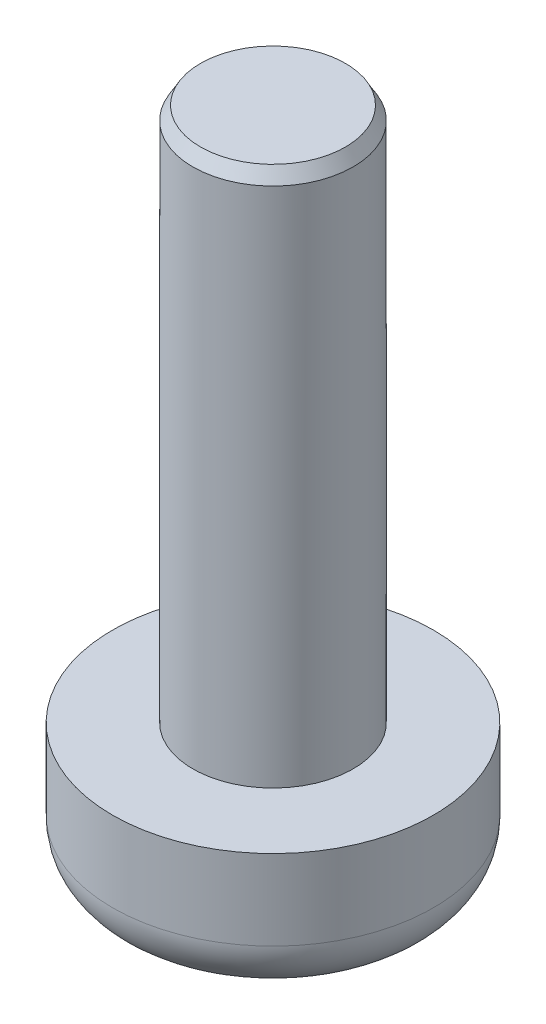
ISO-10303-21;
HEADER;
FILE_DESCRIPTION(('STEP AP214'),'2;1');
FILE_NAME('part.step','',(''),(''),'','','');
FILE_SCHEMA(('AUTOMOTIVE_DESIGN { 1 0 10303 214 1 1 1 1 }'));
ENDSEC;
DATA;
#1=APPLICATION_CONTEXT('core data for automotive mechanical design processes');
#2=APPLICATION_PROTOCOL_DEFINITION('international standard','automotive_design',2000,#1);
#3=PRODUCT_CONTEXT('',#1,'mechanical');
#4=PRODUCT('Part','Part','',(#3));
#5=PRODUCT_RELATED_PRODUCT_CATEGORY('part','',(#4));
#6=PRODUCT_DEFINITION_FORMATION('','',#4);
#7=PRODUCT_DEFINITION_CONTEXT('part definition',#1,'design');
#8=PRODUCT_DEFINITION('design','',#6,#7);
#9=PRODUCT_DEFINITION_SHAPE('','',#8);
#10=(LENGTH_UNIT() NAMED_UNIT(*) SI_UNIT(.MILLI.,.METRE.));
#11=(NAMED_UNIT(*) PLANE_ANGLE_UNIT() SI_UNIT($,.RADIAN.));
#12=(NAMED_UNIT(*) SI_UNIT($,.STERADIAN.) SOLID_ANGLE_UNIT());
#13=UNCERTAINTY_MEASURE_WITH_UNIT(LENGTH_MEASURE(1.E-05),#10,'distance_accuracy_value','');
#14=(GEOMETRIC_REPRESENTATION_CONTEXT(3) GLOBAL_UNCERTAINTY_ASSIGNED_CONTEXT((#13)) GLOBAL_UNIT_ASSIGNED_CONTEXT((#10,
#11,#12)) REPRESENTATION_CONTEXT('',''));
#15=CARTESIAN_POINT('',(0.,0.,0.));
#16=DIRECTION('',(0.,0.,1.));
#17=DIRECTION('',(1.,0.,0.));
#18=AXIS2_PLACEMENT_3D('',#15,#16,#17);
#19=CARTESIAN_POINT('',(0.,10.,0.));
#20=DIRECTION('',(0.,-1.,0.));
#21=DIRECTION('',(0.,0.,-1.));
#22=AXIS2_PLACEMENT_3D('',#19,#20,#21);
#23=CYLINDRICAL_SURFACE('',#22,1.5);
#24=CARTESIAN_POINT('',(0.,9.75,0.));
#25=DIRECTION('',(0.,1.,0.));
#26=DIRECTION('',(0.,0.,1.));
#27=AXIS2_PLACEMENT_3D('',#24,#25,#26);
#28=CIRCLE('',#27,1.5);
#29=CARTESIAN_POINT('',(0.,9.75,1.5));
#30=VERTEX_POINT('',#29);
#31=EDGE_CURVE('E153',#30,#30,#28,.F.);
#32=ORIENTED_EDGE('',*,*,#31,.T.);
#33=EDGE_LOOP('',(#32));
#34=FACE_BOUND('',#33,.T.);
#35=CARTESIAN_POINT('',(0.,0.,0.));
#36=DIRECTION('',(0.,-1.,0.));
#37=DIRECTION('',(0.,0.,-1.));
#38=AXIS2_PLACEMENT_3D('',#35,#36,#37);
#39=CIRCLE('',#38,1.5);
#40=CARTESIAN_POINT('',(0.,0.,-1.5));
#41=VERTEX_POINT('',#40);
#42=EDGE_CURVE('E147',#41,#41,#39,.T.);
#43=ORIENTED_EDGE('',*,*,#42,.F.);
#44=EDGE_LOOP('',(#43));
#45=FACE_BOUND('',#44,.T.);
#46=ADVANCED_FACE('F37',(#34,#45),#23,.T.);
#47=CARTESIAN_POINT('',(0.,10.,0.));
#48=DIRECTION('',(0.,1.,0.));
#49=DIRECTION('',(0.,0.,1.));
#50=AXIS2_PLACEMENT_3D('',#47,#48,#49);
#51=PLANE('',#50);
#52=CARTESIAN_POINT('',(0.,10.,0.));
#53=DIRECTION('',(0.,1.,0.));
#54=DIRECTION('',(0.,0.,1.));
#55=AXIS2_PLACEMENT_3D('',#52,#53,#54);
#56=CIRCLE('',#55,1.35566243270259);
#57=CARTESIAN_POINT('',(0.,10.,1.35566243270259));
#58=VERTEX_POINT('',#57);
#59=EDGE_CURVE('E150',#58,#58,#56,.T.);
#60=ORIENTED_EDGE('',*,*,#59,.T.);
#61=EDGE_LOOP('',(#60));
#62=FACE_BOUND('',#61,.T.);
#63=ADVANCED_FACE('F174',(#62),#51,.T.);
#64=CARTESIAN_POINT('',(0.,10.,0.));
#65=DIRECTION('',(0.,-1.,0.));
#66=DIRECTION('',(0.,0.,-1.));
#67=AXIS2_PLACEMENT_3D('',#64,#65,#66);
#68=CONICAL_SURFACE('',#67,1.35566243270259,0.523598775598299);
#69=ORIENTED_EDGE('',*,*,#31,.F.);
#70=EDGE_LOOP('',(#69));
#71=FACE_BOUND('',#70,.T.);
#72=ORIENTED_EDGE('',*,*,#59,.F.);
#73=EDGE_LOOP('',(#72));
#74=FACE_BOUND('',#73,.T.);
#75=ADVANCED_FACE('F180',(#71,#74),#68,.T.);
#76=CARTESIAN_POINT('',(0.,0.,0.));
#77=DIRECTION('',(0.,-1.,0.));
#78=DIRECTION('',(0.,0.,-1.));
#79=AXIS2_PLACEMENT_3D('',#76,#77,#78);
#80=PLANE('',#79);
#81=CARTESIAN_POINT('',(0.,0.,0.));
#82=DIRECTION('',(0.,-1.,0.));
#83=DIRECTION('',(0.,0.,-1.));
#84=AXIS2_PLACEMENT_3D('',#81,#82,#83);
#85=CIRCLE('',#84,3.);
#86=CARTESIAN_POINT('',(0.,0.,-3.));
#87=VERTEX_POINT('',#86);
#88=EDGE_CURVE('E139',#87,#87,#85,.T.);
#89=ORIENTED_EDGE('',*,*,#88,.F.);
#90=EDGE_LOOP('',(#89));
#91=FACE_BOUND('',#90,.T.);
#92=ORIENTED_EDGE('',*,*,#42,.T.);
#93=EDGE_LOOP('',(#92));
#94=FACE_BOUND('',#93,.T.);
#95=ADVANCED_FACE('F186',(#91,#94),#80,.F.);
#96=CARTESIAN_POINT('',(0.,-2.5,0.));
#97=DIRECTION('',(0.,1.,0.));
#98=DIRECTION('',(0.,0.,1.));
#99=AXIS2_PLACEMENT_3D('',#96,#97,#98);
#100=CYLINDRICAL_SURFACE('',#99,3.);
#101=CARTESIAN_POINT('',(0.,-1.5,0.));
#102=DIRECTION('',(0.,-1.,0.));
#103=DIRECTION('',(0.,0.,-1.));
#104=AXIS2_PLACEMENT_3D('',#101,#102,#103);
#105=CIRCLE('',#104,3.);
#106=CARTESIAN_POINT('',(0.,-1.5,-3.));
#107=VERTEX_POINT('',#106);
#108=EDGE_CURVE('E11',#107,#107,#105,.F.);
#109=ORIENTED_EDGE('',*,*,#108,.T.);
#110=EDGE_LOOP('',(#109));
#111=FACE_BOUND('',#110,.T.);
#112=ORIENTED_EDGE('',*,*,#88,.T.);
#113=EDGE_LOOP('',(#112));
#114=FACE_BOUND('',#113,.T.);
#115=ADVANCED_FACE('F169',(#111,#114),#100,.T.);
#116=CARTESIAN_POINT('',(0.,-2.5,0.));
#117=DIRECTION('',(0.,-1.,0.));
#118=DIRECTION('',(0.,0.,-1.));
#119=AXIS2_PLACEMENT_3D('',#116,#117,#118);
#120=PLANE('',#119);
#121=DIRECTION('',(-0.5,0.,-0.866025403784439));
#122=VECTOR('',#121,1.);
#123=CARTESIAN_POINT('',(-0.793856620135736,-2.5,1.375));
#124=LINE('',#123,#122);
#125=CARTESIAN_POINT('',(-0.793856620135736,-2.5,1.375));
#126=VERTEX_POINT('',#125);
#127=CARTESIAN_POINT('',(-1.58771324027147,-2.5,0.));
#128=VERTEX_POINT('',#127);
#129=EDGE_CURVE('E52',#126,#128,#124,.T.);
#130=ORIENTED_EDGE('',*,*,#129,.F.);
#131=DIRECTION('',(-1.,0.,0.));
#132=VECTOR('',#131,1.);
#133=CARTESIAN_POINT('',(0.793856620135736,-2.5,1.375));
#134=LINE('',#133,#132);
#135=CARTESIAN_POINT('',(0.793856620135736,-2.5,1.375));
#136=VERTEX_POINT('',#135);
#137=EDGE_CURVE('E135',#136,#126,#134,.T.);
#138=ORIENTED_EDGE('',*,*,#137,.F.);
#139=DIRECTION('',(-0.5,0.,0.866025403784438));
#140=VECTOR('',#139,1.);
#141=CARTESIAN_POINT('',(1.58771324027147,-2.5,0.));
#142=LINE('',#141,#140);
#143=CARTESIAN_POINT('',(1.58771324027147,-2.5,0.));
#144=VERTEX_POINT('',#143);
#145=EDGE_CURVE('E133',#144,#136,#142,.T.);
#146=ORIENTED_EDGE('',*,*,#145,.F.);
#147=DIRECTION('',(0.5,0.,0.866025403784439));
#148=VECTOR('',#147,1.);
#149=CARTESIAN_POINT('',(0.793856620135736,-2.5,-1.375));
#150=LINE('',#149,#148);
#151=CARTESIAN_POINT('',(0.793856620135736,-2.5,-1.375));
#152=VERTEX_POINT('',#151);
#153=EDGE_CURVE('E100',#152,#144,#150,.T.);
#154=ORIENTED_EDGE('',*,*,#153,.F.);
#155=DIRECTION('',(1.,0.,0.));
#156=VECTOR('',#155,1.);
#157=CARTESIAN_POINT('',(-0.793856620135736,-2.5,-1.375));
#158=LINE('',#157,#156);
#159=CARTESIAN_POINT('',(-0.793856620135736,-2.5,-1.375));
#160=VERTEX_POINT('',#159);
#161=EDGE_CURVE('E129',#160,#152,#158,.T.);
#162=ORIENTED_EDGE('',*,*,#161,.F.);
#163=DIRECTION('',(0.5,0.,-0.866025403784438));
#164=VECTOR('',#163,1.);
#165=CARTESIAN_POINT('',(-1.58771324027147,-2.5,0.));
#166=LINE('',#165,#164);
#167=EDGE_CURVE('E126',#128,#160,#166,.T.);
#168=ORIENTED_EDGE('',*,*,#167,.F.);
#169=EDGE_LOOP('',(#130,#138,#146,#154,#162,#168));
#170=FACE_BOUND('',#169,.T.);
#171=CARTESIAN_POINT('',(0.,-2.5,0.));
#172=DIRECTION('',(0.,-1.,0.));
#173=DIRECTION('',(0.,0.,-1.));
#174=AXIS2_PLACEMENT_3D('',#171,#172,#173);
#175=CIRCLE('',#174,2.);
#176=CARTESIAN_POINT('',(0.,-2.5,-2.));
#177=VERTEX_POINT('',#176);
#178=EDGE_CURVE('E45',#177,#177,#175,.T.);
#179=ORIENTED_EDGE('',*,*,#178,.T.);
#180=EDGE_LOOP('',(#179));
#181=FACE_BOUND('',#180,.T.);
#182=ADVANCED_FACE('F158',(#170,#181),#120,.T.);
#183=CARTESIAN_POINT('',(0.,-1.5,0.));
#184=DIRECTION('',(0.,-1.,0.));
#185=DIRECTION('',(0.,0.,-1.));
#186=AXIS2_PLACEMENT_3D('',#183,#184,#185);
#187=TOROIDAL_SURFACE('',#186,2.,1.);
#188=ORIENTED_EDGE('',*,*,#108,.F.);
#189=EDGE_LOOP('',(#188));
#190=FACE_BOUND('',#189,.T.);
#191=ORIENTED_EDGE('',*,*,#178,.F.);
#192=EDGE_LOOP('',(#191));
#193=FACE_BOUND('',#192,.T.);
#194=ADVANCED_FACE('F39',(#190,#193),#187,.T.);
#195=CARTESIAN_POINT('',(-0.793856620135736,-0.5,1.375));
#196=DIRECTION('',(-0.866025403784439,0.,0.5));
#197=DIRECTION('',(0.5,0.,0.866025403784439));
#198=AXIS2_PLACEMENT_3D('',#195,#196,#197);
#199=PLANE('',#198);
#200=ORIENTED_EDGE('',*,*,#129,.T.);
#201=DIRECTION('',(0.,-1.,0.));
#202=VECTOR('',#201,1.);
#203=CARTESIAN_POINT('',(-1.58771324027147,-0.5,0.));
#204=LINE('',#203,#202);
#205=CARTESIAN_POINT('',(-1.58771324027147,-0.5,0.));
#206=VERTEX_POINT('',#205);
#207=EDGE_CURVE('E82',#206,#128,#204,.T.);
#208=ORIENTED_EDGE('',*,*,#207,.F.);
#209=DIRECTION('',(-0.5,0.,-0.866025403784439));
#210=VECTOR('',#209,1.);
#211=CARTESIAN_POINT('',(-0.793856620135736,-0.5,1.375));
#212=LINE('',#211,#210);
#213=CARTESIAN_POINT('',(-0.793856620135736,-0.5,1.375));
#214=VERTEX_POINT('',#213);
#215=EDGE_CURVE('E137',#214,#206,#212,.T.);
#216=ORIENTED_EDGE('',*,*,#215,.F.);
#217=DIRECTION('',(0.,-1.,0.));
#218=VECTOR('',#217,1.);
#219=CARTESIAN_POINT('',(-0.793856620135736,-0.5,1.375));
#220=LINE('',#219,#218);
#221=EDGE_CURVE('E60',#214,#126,#220,.T.);
#222=ORIENTED_EDGE('',*,*,#221,.T.);
#223=EDGE_LOOP('',(#200,#208,#216,#222));
#224=FACE_BOUND('',#223,.T.);
#225=ADVANCED_FACE('F161',(#224),#199,.F.);
#226=CARTESIAN_POINT('',(0.793856620135736,-0.5,1.375));
#227=DIRECTION('',(0.,0.,1.));
#228=DIRECTION('',(1.,0.,0.));
#229=AXIS2_PLACEMENT_3D('',#226,#227,#228);
#230=PLANE('',#229);
#231=ORIENTED_EDGE('',*,*,#137,.T.);
#232=ORIENTED_EDGE('',*,*,#221,.F.);
#233=DIRECTION('',(-1.,0.,0.));
#234=VECTOR('',#233,1.);
#235=CARTESIAN_POINT('',(0.793856620135736,-0.5,1.375));
#236=LINE('',#235,#234);
#237=CARTESIAN_POINT('',(0.793856620135736,-0.5,1.375));
#238=VERTEX_POINT('',#237);
#239=EDGE_CURVE('E112',#238,#214,#236,.T.);
#240=ORIENTED_EDGE('',*,*,#239,.F.);
#241=DIRECTION('',(0.,-1.,0.));
#242=VECTOR('',#241,1.);
#243=CARTESIAN_POINT('',(0.793856620135736,-0.5,1.375));
#244=LINE('',#243,#242);
#245=EDGE_CURVE('E104',#238,#136,#244,.T.);
#246=ORIENTED_EDGE('',*,*,#245,.T.);
#247=EDGE_LOOP('',(#231,#232,#240,#246));
#248=FACE_BOUND('',#247,.T.);
#249=ADVANCED_FACE('F167',(#248),#230,.F.);
#250=CARTESIAN_POINT('',(1.58771324027147,-0.5,0.));
#251=DIRECTION('',(0.866025403784439,0.,0.5));
#252=DIRECTION('',(0.5,0.,-0.866025403784438));
#253=AXIS2_PLACEMENT_3D('',#250,#251,#252);
#254=PLANE('',#253);
#255=ORIENTED_EDGE('',*,*,#145,.T.);
#256=ORIENTED_EDGE('',*,*,#245,.F.);
#257=DIRECTION('',(-0.5,0.,0.866025403784438));
#258=VECTOR('',#257,1.);
#259=CARTESIAN_POINT('',(1.58771324027147,-0.5,0.));
#260=LINE('',#259,#258);
#261=CARTESIAN_POINT('',(1.58771324027147,-0.5,0.));
#262=VERTEX_POINT('',#261);
#263=EDGE_CURVE('E108',#262,#238,#260,.T.);
#264=ORIENTED_EDGE('',*,*,#263,.F.);
#265=DIRECTION('',(0.,-1.,0.));
#266=VECTOR('',#265,1.);
#267=CARTESIAN_POINT('',(1.58771324027147,-0.5,0.));
#268=LINE('',#267,#266);
#269=EDGE_CURVE('E93',#262,#144,#268,.T.);
#270=ORIENTED_EDGE('',*,*,#269,.T.);
#271=EDGE_LOOP('',(#255,#256,#264,#270));
#272=FACE_BOUND('',#271,.T.);
#273=ADVANCED_FACE('F109',(#272),#254,.F.);
#274=CARTESIAN_POINT('',(0.793856620135736,-0.5,-1.375));
#275=DIRECTION('',(0.866025403784439,0.,-0.5));
#276=DIRECTION('',(-0.5,0.,-0.866025403784439));
#277=AXIS2_PLACEMENT_3D('',#274,#275,#276);
#278=PLANE('',#277);
#279=ORIENTED_EDGE('',*,*,#153,.T.);
#280=ORIENTED_EDGE('',*,*,#269,.F.);
#281=DIRECTION('',(0.5,0.,0.866025403784439));
#282=VECTOR('',#281,1.);
#283=CARTESIAN_POINT('',(0.793856620135736,-0.5,-1.375));
#284=LINE('',#283,#282);
#285=CARTESIAN_POINT('',(0.793856620135736,-0.5,-1.375));
#286=VERTEX_POINT('',#285);
#287=EDGE_CURVE('E97',#286,#262,#284,.T.);
#288=ORIENTED_EDGE('',*,*,#287,.F.);
#289=DIRECTION('',(0.,-1.,0.));
#290=VECTOR('',#289,1.);
#291=CARTESIAN_POINT('',(0.793856620135736,-0.5,-1.375));
#292=LINE('',#291,#290);
#293=EDGE_CURVE('E105',#286,#152,#292,.T.);
#294=ORIENTED_EDGE('',*,*,#293,.T.);
#295=EDGE_LOOP('',(#279,#280,#288,#294));
#296=FACE_BOUND('',#295,.T.);
#297=ADVANCED_FACE('F95',(#296),#278,.F.);
#298=CARTESIAN_POINT('',(-0.793856620135736,-0.5,-1.375));
#299=DIRECTION('',(0.,0.,-1.));
#300=DIRECTION('',(-1.,0.,0.));
#301=AXIS2_PLACEMENT_3D('',#298,#299,#300);
#302=PLANE('',#301);
#303=ORIENTED_EDGE('',*,*,#161,.T.);
#304=ORIENTED_EDGE('',*,*,#293,.F.);
#305=DIRECTION('',(1.,0.,0.));
#306=VECTOR('',#305,1.);
#307=CARTESIAN_POINT('',(-0.793856620135736,-0.5,-1.375));
#308=LINE('',#307,#306);
#309=CARTESIAN_POINT('',(-0.793856620135736,-0.5,-1.375));
#310=VERTEX_POINT('',#309);
#311=EDGE_CURVE('E118',#310,#286,#308,.T.);
#312=ORIENTED_EDGE('',*,*,#311,.F.);
#313=DIRECTION('',(0.,-1.,0.));
#314=VECTOR('',#313,1.);
#315=CARTESIAN_POINT('',(-0.793856620135736,-0.5,-1.375));
#316=LINE('',#315,#314);
#317=EDGE_CURVE('E142',#310,#160,#316,.T.);
#318=ORIENTED_EDGE('',*,*,#317,.T.);
#319=EDGE_LOOP('',(#303,#304,#312,#318));
#320=FACE_BOUND('',#319,.T.);
#321=ADVANCED_FACE('F206',(#320),#302,.F.);
#322=CARTESIAN_POINT('',(-1.58771324027147,-0.5,0.));
#323=DIRECTION('',(-0.866025403784439,0.,-0.5));
#324=DIRECTION('',(-0.5,0.,0.866025403784439));
#325=AXIS2_PLACEMENT_3D('',#322,#323,#324);
#326=PLANE('',#325);
#327=ORIENTED_EDGE('',*,*,#167,.T.);
#328=ORIENTED_EDGE('',*,*,#317,.F.);
#329=DIRECTION('',(0.5,0.,-0.866025403784438));
#330=VECTOR('',#329,1.);
#331=CARTESIAN_POINT('',(-1.58771324027147,-0.5,0.));
#332=LINE('',#331,#330);
#333=EDGE_CURVE('E120',#206,#310,#332,.T.);
#334=ORIENTED_EDGE('',*,*,#333,.F.);
#335=ORIENTED_EDGE('',*,*,#207,.T.);
#336=EDGE_LOOP('',(#327,#328,#334,#335));
#337=FACE_BOUND('',#336,.T.);
#338=ADVANCED_FACE('F203',(#337),#326,.F.);
#339=CARTESIAN_POINT('',(0.,-0.5,0.));
#340=DIRECTION('',(0.,-1.,0.));
#341=DIRECTION('',(0.,0.,-1.));
#342=AXIS2_PLACEMENT_3D('',#339,#340,#341);
#343=PLANE('',#342);
#344=ORIENTED_EDGE('',*,*,#215,.T.);
#345=ORIENTED_EDGE('',*,*,#333,.T.);
#346=ORIENTED_EDGE('',*,*,#311,.T.);
#347=ORIENTED_EDGE('',*,*,#287,.T.);
#348=ORIENTED_EDGE('',*,*,#263,.T.);
#349=ORIENTED_EDGE('',*,*,#239,.T.);
#350=EDGE_LOOP('',(#344,#345,#346,#347,#348,#349));
#351=FACE_BOUND('',#350,.T.);
#352=ADVANCED_FACE('F115',(#351),#343,.T.);
#353=CLOSED_SHELL('',(#46,#63,#75,#95,#115,#182,#194,#225,#249,#273,#297,#321,#338,#352));
#354=MANIFOLD_SOLID_BREP('B2',#353);
#355=ADVANCED_BREP_SHAPE_REPRESENTATION('',(#18,#354),#14);
#356=SHAPE_DEFINITION_REPRESENTATION(#9,#355);
ENDSEC;
END-ISO-10303-21;
